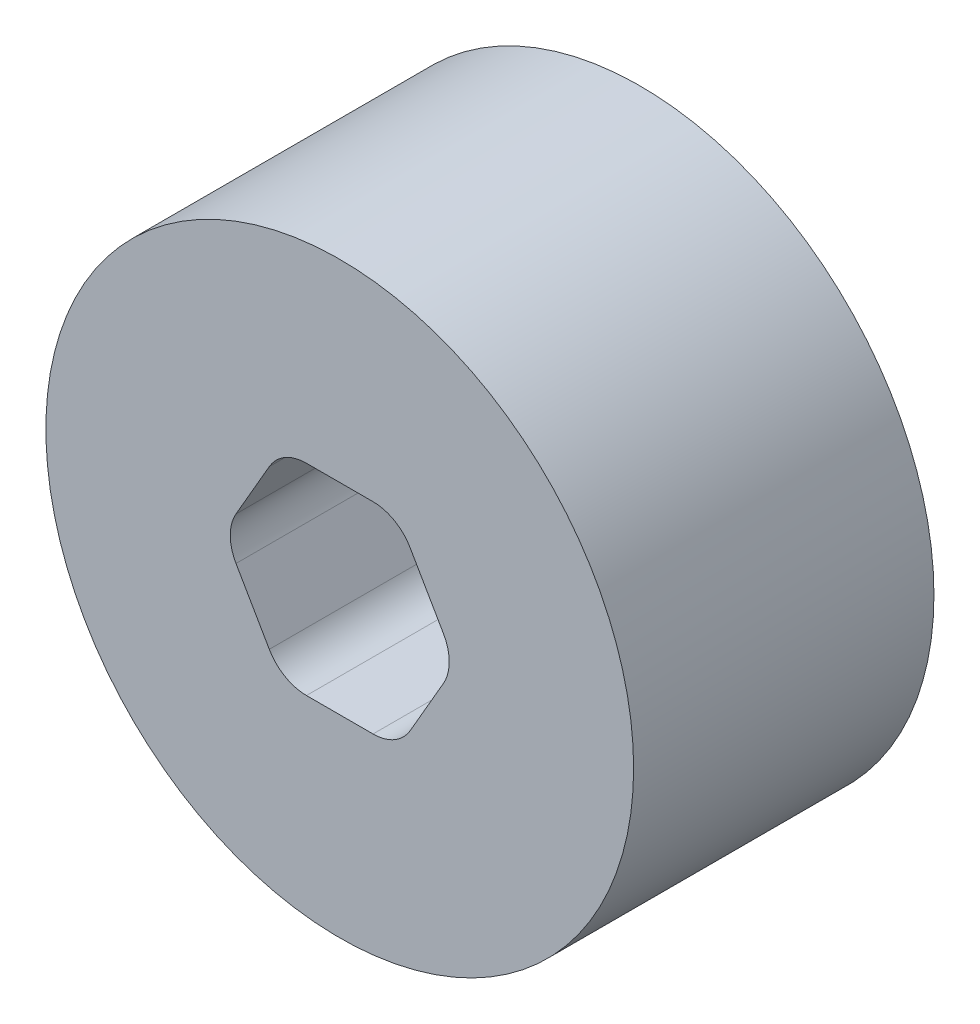
ISO-10303-21;
HEADER;
FILE_DESCRIPTION(('STEP AP214'),'2;1');
FILE_NAME('part.step','',(''),(''),'','','');
FILE_SCHEMA(('AUTOMOTIVE_DESIGN { 1 0 10303 214 1 1 1 1 }'));
ENDSEC;
DATA;
#1=APPLICATION_CONTEXT('core data for automotive mechanical design processes');
#2=APPLICATION_PROTOCOL_DEFINITION('international standard','automotive_design',2000,#1);
#3=PRODUCT_CONTEXT('',#1,'mechanical');
#4=PRODUCT('Part','Part','',(#3));
#5=PRODUCT_RELATED_PRODUCT_CATEGORY('part','',(#4));
#6=PRODUCT_DEFINITION_FORMATION('','',#4);
#7=PRODUCT_DEFINITION_CONTEXT('part definition',#1,'design');
#8=PRODUCT_DEFINITION('design','',#6,#7);
#9=PRODUCT_DEFINITION_SHAPE('','',#8);
#10=(LENGTH_UNIT() NAMED_UNIT(*) SI_UNIT(.MILLI.,.METRE.));
#11=(NAMED_UNIT(*) PLANE_ANGLE_UNIT() SI_UNIT($,.RADIAN.));
#12=(NAMED_UNIT(*) SI_UNIT($,.STERADIAN.) SOLID_ANGLE_UNIT());
#13=UNCERTAINTY_MEASURE_WITH_UNIT(LENGTH_MEASURE(1.E-05),#10,'distance_accuracy_value','');
#14=(GEOMETRIC_REPRESENTATION_CONTEXT(3) GLOBAL_UNCERTAINTY_ASSIGNED_CONTEXT((#13)) GLOBAL_UNIT_ASSIGNED_CONTEXT((#10,
#11,#12)) REPRESENTATION_CONTEXT('',''));
#15=CARTESIAN_POINT('',(0.,0.,0.));
#16=DIRECTION('',(0.,0.,1.));
#17=DIRECTION('',(1.,0.,0.));
#18=AXIS2_PLACEMENT_3D('',#15,#16,#17);
#19=CARTESIAN_POINT('',(0.,0.,17.78));
#20=DIRECTION('',(0.,0.,1.));
#21=DIRECTION('',(1.,0.,0.));
#22=AXIS2_PLACEMENT_3D('',#19,#20,#21);
#23=PLANE('',#22);
#24=CARTESIAN_POINT('',(0.,0.,17.78));
#25=DIRECTION('',(0.,0.,1.));
#26=DIRECTION('',(1.,0.,0.));
#27=AXIS2_PLACEMENT_3D('',#24,#25,#26);
#28=CIRCLE('',#27,17.399);
#29=CARTESIAN_POINT('',(17.399,0.,17.78));
#30=VERTEX_POINT('',#29);
#31=EDGE_CURVE('E160',#30,#30,#28,.T.);
#32=ORIENTED_EDGE('',*,*,#31,.T.);
#33=EDGE_LOOP('',(#32));
#34=FACE_BOUND('',#33,.T.);
#35=DIRECTION('',(-0.500000000000001,0.866025403784438,0.));
#36=VECTOR('',#35,1.);
#37=CARTESIAN_POINT('',(6.87578,0.,17.78));
#38=LINE('',#37,#36);
#39=CARTESIAN_POINT('',(6.14254515812918,1.26999999999999,17.78));
#40=VERTEX_POINT('',#39);
#41=CARTESIAN_POINT('',(4.17112484187082,4.68460015083297,17.78));
#42=VERTEX_POINT('',#41);
#43=EDGE_CURVE('E265',#40,#42,#38,.T.);
#44=ORIENTED_EDGE('',*,*,#43,.F.);
#45=CARTESIAN_POINT('',(3.94284063251671,0.,17.78));
#46=DIRECTION('',(0.,0.,1.));
#47=DIRECTION('',(1.,0.,0.));
#48=AXIS2_PLACEMENT_3D('',#45,#46,#47);
#49=CIRCLE('',#48,2.54);
#50=CARTESIAN_POINT('',(6.14254515812919,-1.26999999999999,17.78));
#51=VERTEX_POINT('',#50);
#52=EDGE_CURVE('E143',#40,#51,#49,.F.);
#53=ORIENTED_EDGE('',*,*,#52,.T.);
#54=DIRECTION('',(0.499999999999995,0.866025403784442,0.));
#55=VECTOR('',#54,1.);
#56=CARTESIAN_POINT('',(3.43789000000007,-5.95460015083293,17.78));
#57=LINE('',#56,#55);
#58=CARTESIAN_POINT('',(4.17112484187088,-4.68460015083293,17.78));
#59=VERTEX_POINT('',#58);
#60=EDGE_CURVE('E263',#59,#51,#57,.T.);
#61=ORIENTED_EDGE('',*,*,#60,.F.);
#62=CARTESIAN_POINT('',(1.9714203162584,-3.41460015083294,17.78));
#63=DIRECTION('',(0.,0.,1.));
#64=DIRECTION('',(1.,0.,0.));
#65=AXIS2_PLACEMENT_3D('',#62,#63,#64);
#66=CIRCLE('',#65,2.54);
#67=CARTESIAN_POINT('',(1.97142031625843,-5.95460015083294,17.78));
#68=VERTEX_POINT('',#67);
#69=EDGE_CURVE('E11',#59,#68,#66,.F.);
#70=ORIENTED_EDGE('',*,*,#69,.T.);
#71=DIRECTION('',(1.,0.,0.));
#72=VECTOR('',#71,1.);
#73=CARTESIAN_POINT('',(-3.43788999999994,-5.954600150833,17.78));
#74=LINE('',#73,#72);
#75=CARTESIAN_POINT('',(-1.97142031625829,-5.95460015083298,17.78));
#76=VERTEX_POINT('',#75);
#77=EDGE_CURVE('E238',#76,#68,#74,.T.);
#78=ORIENTED_EDGE('',*,*,#77,.F.);
#79=CARTESIAN_POINT('',(-1.97142031625832,-3.41460015083298,17.78));
#80=DIRECTION('',(0.,0.,1.));
#81=DIRECTION('',(1.,0.,0.));
#82=AXIS2_PLACEMENT_3D('',#79,#80,#81);
#83=CIRCLE('',#82,2.54);
#84=CARTESIAN_POINT('',(-4.17112484187078,-4.684600150833,17.78));
#85=VERTEX_POINT('',#84);
#86=EDGE_CURVE('E225',#76,#85,#83,.F.);
#87=ORIENTED_EDGE('',*,*,#86,.T.);
#88=DIRECTION('',(0.500000000000007,-0.866025403784435,0.));
#89=VECTOR('',#88,1.);
#90=CARTESIAN_POINT('',(-6.87578,0.,17.78));
#91=LINE('',#90,#89);
#92=CARTESIAN_POINT('',(-6.14254515812916,-1.27000000000005,17.78));
#93=VERTEX_POINT('',#92);
#94=EDGE_CURVE('E241',#93,#85,#91,.T.);
#95=ORIENTED_EDGE('',*,*,#94,.F.);
#96=CARTESIAN_POINT('',(-3.9428406325167,0.,17.78));
#97=DIRECTION('',(0.,0.,1.));
#98=DIRECTION('',(1.,0.,0.));
#99=AXIS2_PLACEMENT_3D('',#96,#97,#98);
#100=CIRCLE('',#99,2.54);
#101=CARTESIAN_POINT('',(-6.14254515812918,1.26999999999996,17.78));
#102=VERTEX_POINT('',#101);
#103=EDGE_CURVE('E219',#93,#102,#100,.F.);
#104=ORIENTED_EDGE('',*,*,#103,.T.);
#105=DIRECTION('',(-0.499999999999995,-0.866025403784442,0.));
#106=VECTOR('',#105,1.);
#107=CARTESIAN_POINT('',(-3.43789000000003,5.95460015083295,17.78));
#108=LINE('',#107,#106);
#109=CARTESIAN_POINT('',(-4.17112484187085,4.68460015083294,17.78));
#110=VERTEX_POINT('',#109);
#111=EDGE_CURVE('E247',#110,#102,#108,.T.);
#112=ORIENTED_EDGE('',*,*,#111,.F.);
#113=CARTESIAN_POINT('',(-1.97142031625836,3.41460015083296,17.78));
#114=DIRECTION('',(0.,0.,1.));
#115=DIRECTION('',(1.,0.,0.));
#116=AXIS2_PLACEMENT_3D('',#113,#114,#115);
#117=CIRCLE('',#116,2.54);
#118=CARTESIAN_POINT('',(-1.97142031625837,5.95460015083296,17.78));
#119=VERTEX_POINT('',#118);
#120=EDGE_CURVE('E213',#110,#119,#117,.F.);
#121=ORIENTED_EDGE('',*,*,#120,.T.);
#122=DIRECTION('',(-1.,0.,0.));
#123=VECTOR('',#122,1.);
#124=CARTESIAN_POINT('',(3.43788999999999,5.95460015083298,17.78));
#125=LINE('',#124,#123);
#126=CARTESIAN_POINT('',(1.97142031625833,5.95460015083297,17.78));
#127=VERTEX_POINT('',#126);
#128=EDGE_CURVE('E268',#127,#119,#125,.T.);
#129=ORIENTED_EDGE('',*,*,#128,.F.);
#130=CARTESIAN_POINT('',(1.97142031625834,3.41460015083297,17.78));
#131=DIRECTION('',(0.,0.,1.));
#132=DIRECTION('',(1.,0.,0.));
#133=AXIS2_PLACEMENT_3D('',#130,#131,#132);
#134=CIRCLE('',#133,2.54);
#135=EDGE_CURVE('E144',#127,#42,#134,.F.);
#136=ORIENTED_EDGE('',*,*,#135,.T.);
#137=EDGE_LOOP('',(#44,#53,#61,#70,#78,#87,#95,#104,#112,#121,#129,#136));
#138=FACE_BOUND('',#137,.T.);
#139=ADVANCED_FACE('F41',(#34,#138),#23,.T.);
#140=CARTESIAN_POINT('',(0.,0.,0.));
#141=DIRECTION('',(0.,0.,1.));
#142=DIRECTION('',(1.,0.,0.));
#143=AXIS2_PLACEMENT_3D('',#140,#141,#142);
#144=PLANE('',#143);
#145=CARTESIAN_POINT('',(0.,0.,0.));
#146=DIRECTION('',(0.,0.,1.));
#147=DIRECTION('',(1.,0.,0.));
#148=AXIS2_PLACEMENT_3D('',#145,#146,#147);
#149=CIRCLE('',#148,17.399);
#150=CARTESIAN_POINT('',(17.399,0.,0.));
#151=VERTEX_POINT('',#150);
#152=EDGE_CURVE('E167',#151,#151,#149,.T.);
#153=ORIENTED_EDGE('',*,*,#152,.F.);
#154=EDGE_LOOP('',(#153));
#155=FACE_BOUND('',#154,.T.);
#156=DIRECTION('',(1.,0.,0.));
#157=VECTOR('',#156,1.);
#158=CARTESIAN_POINT('',(-3.43788999999994,-5.954600150833,0.));
#159=LINE('',#158,#157);
#160=CARTESIAN_POINT('',(-1.97142031625829,-5.95460015083298,0.));
#161=VERTEX_POINT('',#160);
#162=CARTESIAN_POINT('',(1.97142031625843,-5.95460015083294,0.));
#163=VERTEX_POINT('',#162);
#164=EDGE_CURVE('E228',#161,#163,#159,.T.);
#165=ORIENTED_EDGE('',*,*,#164,.T.);
#166=CARTESIAN_POINT('',(1.9714203162584,-3.41460015083294,0.));
#167=DIRECTION('',(0.,0.,1.));
#168=DIRECTION('',(1.,0.,0.));
#169=AXIS2_PLACEMENT_3D('',#166,#167,#168);
#170=CIRCLE('',#169,2.54);
#171=CARTESIAN_POINT('',(4.17112484187088,-4.68460015083293,0.));
#172=VERTEX_POINT('',#171);
#173=EDGE_CURVE('E50',#163,#172,#170,.T.);
#174=ORIENTED_EDGE('',*,*,#173,.T.);
#175=DIRECTION('',(0.499999999999995,0.866025403784442,0.));
#176=VECTOR('',#175,1.);
#177=CARTESIAN_POINT('',(3.43789000000007,-5.95460015083293,0.));
#178=LINE('',#177,#176);
#179=CARTESIAN_POINT('',(6.14254515812919,-1.26999999999999,0.));
#180=VERTEX_POINT('',#179);
#181=EDGE_CURVE('E137',#172,#180,#178,.T.);
#182=ORIENTED_EDGE('',*,*,#181,.T.);
#183=CARTESIAN_POINT('',(3.94284063251671,0.,0.));
#184=DIRECTION('',(0.,0.,1.));
#185=DIRECTION('',(1.,0.,0.));
#186=AXIS2_PLACEMENT_3D('',#183,#184,#185);
#187=CIRCLE('',#186,2.54);
#188=CARTESIAN_POINT('',(6.14254515812918,1.26999999999999,0.));
#189=VERTEX_POINT('',#188);
#190=EDGE_CURVE('E131',#180,#189,#187,.T.);
#191=ORIENTED_EDGE('',*,*,#190,.T.);
#192=DIRECTION('',(-0.500000000000001,0.866025403784438,0.));
#193=VECTOR('',#192,1.);
#194=CARTESIAN_POINT('',(6.87578,0.,0.));
#195=LINE('',#194,#193);
#196=CARTESIAN_POINT('',(4.17112484187082,4.68460015083297,0.));
#197=VERTEX_POINT('',#196);
#198=EDGE_CURVE('E135',#189,#197,#195,.T.);
#199=ORIENTED_EDGE('',*,*,#198,.T.);
#200=CARTESIAN_POINT('',(1.97142031625834,3.41460015083297,0.));
#201=DIRECTION('',(0.,0.,1.));
#202=DIRECTION('',(1.,0.,0.));
#203=AXIS2_PLACEMENT_3D('',#200,#201,#202);
#204=CIRCLE('',#203,2.54);
#205=CARTESIAN_POINT('',(1.97142031625833,5.95460015083297,0.));
#206=VERTEX_POINT('',#205);
#207=EDGE_CURVE('E203',#197,#206,#204,.T.);
#208=ORIENTED_EDGE('',*,*,#207,.T.);
#209=DIRECTION('',(-1.,0.,0.));
#210=VECTOR('',#209,1.);
#211=CARTESIAN_POINT('',(3.43788999999999,5.95460015083298,0.));
#212=LINE('',#211,#210);
#213=CARTESIAN_POINT('',(-1.97142031625837,5.95460015083296,0.));
#214=VERTEX_POINT('',#213);
#215=EDGE_CURVE('E155',#206,#214,#212,.T.);
#216=ORIENTED_EDGE('',*,*,#215,.T.);
#217=CARTESIAN_POINT('',(-1.97142031625836,3.41460015083296,0.));
#218=DIRECTION('',(0.,0.,1.));
#219=DIRECTION('',(1.,0.,0.));
#220=AXIS2_PLACEMENT_3D('',#217,#218,#219);
#221=CIRCLE('',#220,2.54);
#222=CARTESIAN_POINT('',(-4.17112484187085,4.68460015083294,0.));
#223=VERTEX_POINT('',#222);
#224=EDGE_CURVE('E210',#214,#223,#221,.T.);
#225=ORIENTED_EDGE('',*,*,#224,.T.);
#226=DIRECTION('',(-0.499999999999995,-0.866025403784442,0.));
#227=VECTOR('',#226,1.);
#228=CARTESIAN_POINT('',(-3.43789000000003,5.95460015083295,0.));
#229=LINE('',#228,#227);
#230=CARTESIAN_POINT('',(-6.14254515812918,1.26999999999996,0.));
#231=VERTEX_POINT('',#230);
#232=EDGE_CURVE('E254',#223,#231,#229,.T.);
#233=ORIENTED_EDGE('',*,*,#232,.T.);
#234=CARTESIAN_POINT('',(-3.9428406325167,0.,0.));
#235=DIRECTION('',(0.,0.,1.));
#236=DIRECTION('',(1.,0.,0.));
#237=AXIS2_PLACEMENT_3D('',#234,#235,#236);
#238=CIRCLE('',#237,2.54);
#239=CARTESIAN_POINT('',(-6.14254515812916,-1.27000000000005,0.));
#240=VERTEX_POINT('',#239);
#241=EDGE_CURVE('E216',#231,#240,#238,.T.);
#242=ORIENTED_EDGE('',*,*,#241,.T.);
#243=DIRECTION('',(0.500000000000007,-0.866025403784435,0.));
#244=VECTOR('',#243,1.);
#245=CARTESIAN_POINT('',(-6.87578,0.,0.));
#246=LINE('',#245,#244);
#247=CARTESIAN_POINT('',(-4.17112484187078,-4.684600150833,0.));
#248=VERTEX_POINT('',#247);
#249=EDGE_CURVE('E258',#240,#248,#246,.T.);
#250=ORIENTED_EDGE('',*,*,#249,.T.);
#251=CARTESIAN_POINT('',(-1.97142031625832,-3.41460015083298,0.));
#252=DIRECTION('',(0.,0.,1.));
#253=DIRECTION('',(1.,0.,0.));
#254=AXIS2_PLACEMENT_3D('',#251,#252,#253);
#255=CIRCLE('',#254,2.54);
#256=EDGE_CURVE('E222',#248,#161,#255,.T.);
#257=ORIENTED_EDGE('',*,*,#256,.T.);
#258=EDGE_LOOP('',(#165,#174,#182,#191,#199,#208,#216,#225,#233,#242,#250,#257));
#259=FACE_BOUND('',#258,.T.);
#260=ADVANCED_FACE('F134',(#155,#259),#144,.F.);
#261=CARTESIAN_POINT('',(0.,0.,17.78));
#262=DIRECTION('',(0.,0.,-1.));
#263=DIRECTION('',(-1.,0.,0.));
#264=AXIS2_PLACEMENT_3D('',#261,#262,#263);
#265=CYLINDRICAL_SURFACE('',#264,17.399);
#266=ORIENTED_EDGE('',*,*,#31,.F.);
#267=EDGE_LOOP('',(#266));
#268=FACE_BOUND('',#267,.T.);
#269=ORIENTED_EDGE('',*,*,#152,.T.);
#270=EDGE_LOOP('',(#269));
#271=FACE_BOUND('',#270,.T.);
#272=ADVANCED_FACE('F299',(#268,#271),#265,.T.);
#273=CARTESIAN_POINT('',(3.43789000000007,-5.95460015083293,17.78));
#274=DIRECTION('',(-0.866025403784441,0.499999999999995,0.));
#275=DIRECTION('',(-0.499999999999995,-0.866025403784442,0.));
#276=AXIS2_PLACEMENT_3D('',#273,#274,#275);
#277=PLANE('',#276);
#278=ORIENTED_EDGE('',*,*,#60,.T.);
#279=DIRECTION('',(0.,0.,-1.));
#280=VECTOR('',#279,1.);
#281=CARTESIAN_POINT('',(6.14254515812919,-1.27,0.));
#282=LINE('',#281,#280);
#283=EDGE_CURVE('E180',#51,#180,#282,.T.);
#284=ORIENTED_EDGE('',*,*,#283,.T.);
#285=ORIENTED_EDGE('',*,*,#181,.F.);
#286=DIRECTION('',(0.,0.,-1.));
#287=VECTOR('',#286,1.);
#288=CARTESIAN_POINT('',(4.17112484187088,-4.68460015083293,17.78));
#289=LINE('',#288,#287);
#290=EDGE_CURVE('E177',#172,#59,#289,.F.);
#291=ORIENTED_EDGE('',*,*,#290,.T.);
#292=EDGE_LOOP('',(#278,#284,#285,#291));
#293=FACE_BOUND('',#292,.T.);
#294=ADVANCED_FACE('F234',(#293),#277,.T.);
#295=CARTESIAN_POINT('',(6.87578,0.,17.78));
#296=DIRECTION('',(-0.866025403784438,-0.500000000000001,0.));
#297=DIRECTION('',(0.500000000000001,-0.866025403784438,0.));
#298=AXIS2_PLACEMENT_3D('',#295,#296,#297);
#299=PLANE('',#298);
#300=ORIENTED_EDGE('',*,*,#43,.T.);
#301=DIRECTION('',(0.,0.,-1.));
#302=VECTOR('',#301,1.);
#303=CARTESIAN_POINT('',(4.17112484187081,4.68460015083297,0.));
#304=LINE('',#303,#302);
#305=EDGE_CURVE('E153',#42,#197,#304,.T.);
#306=ORIENTED_EDGE('',*,*,#305,.T.);
#307=ORIENTED_EDGE('',*,*,#198,.F.);
#308=DIRECTION('',(0.,0.,-1.));
#309=VECTOR('',#308,1.);
#310=CARTESIAN_POINT('',(6.14254515812918,1.26999999999999,17.78));
#311=LINE('',#310,#309);
#312=EDGE_CURVE('E150',#189,#40,#311,.F.);
#313=ORIENTED_EDGE('',*,*,#312,.T.);
#314=EDGE_LOOP('',(#300,#306,#307,#313));
#315=FACE_BOUND('',#314,.T.);
#316=ADVANCED_FACE('F149',(#315),#299,.T.);
#317=CARTESIAN_POINT('',(3.43788999999999,5.95460015083298,17.78));
#318=DIRECTION('',(0.,-1.,0.));
#319=DIRECTION('',(1.,0.,0.));
#320=AXIS2_PLACEMENT_3D('',#317,#318,#319);
#321=PLANE('',#320);
#322=ORIENTED_EDGE('',*,*,#215,.F.);
#323=DIRECTION('',(0.,0.,-1.));
#324=VECTOR('',#323,1.);
#325=CARTESIAN_POINT('',(1.97142031625833,5.95460015083297,17.78));
#326=LINE('',#325,#324);
#327=EDGE_CURVE('E174',#206,#127,#326,.F.);
#328=ORIENTED_EDGE('',*,*,#327,.T.);
#329=ORIENTED_EDGE('',*,*,#128,.T.);
#330=DIRECTION('',(0.,0.,-1.));
#331=VECTOR('',#330,1.);
#332=CARTESIAN_POINT('',(-1.97142031625837,5.95460015083296,0.));
#333=LINE('',#332,#331);
#334=EDGE_CURVE('E164',#119,#214,#333,.T.);
#335=ORIENTED_EDGE('',*,*,#334,.T.);
#336=EDGE_LOOP('',(#322,#328,#329,#335));
#337=FACE_BOUND('',#336,.T.);
#338=ADVANCED_FACE('F378',(#337),#321,.T.);
#339=CARTESIAN_POINT('',(-3.43789000000003,5.95460015083295,17.78));
#340=DIRECTION('',(0.866025403784442,-0.499999999999995,0.));
#341=DIRECTION('',(0.499999999999995,0.866025403784442,0.));
#342=AXIS2_PLACEMENT_3D('',#339,#340,#341);
#343=PLANE('',#342);
#344=ORIENTED_EDGE('',*,*,#232,.F.);
#345=DIRECTION('',(0.,0.,-1.));
#346=VECTOR('',#345,1.);
#347=CARTESIAN_POINT('',(-4.17112484187085,4.68460015083294,17.78));
#348=LINE('',#347,#346);
#349=EDGE_CURVE('E187',#223,#110,#348,.F.);
#350=ORIENTED_EDGE('',*,*,#349,.T.);
#351=ORIENTED_EDGE('',*,*,#111,.T.);
#352=DIRECTION('',(0.,0.,-1.));
#353=VECTOR('',#352,1.);
#354=CARTESIAN_POINT('',(-6.14254515812918,1.26999999999996,0.));
#355=LINE('',#354,#353);
#356=EDGE_CURVE('E183',#102,#231,#355,.T.);
#357=ORIENTED_EDGE('',*,*,#356,.T.);
#358=EDGE_LOOP('',(#344,#350,#351,#357));
#359=FACE_BOUND('',#358,.T.);
#360=ADVANCED_FACE('F279',(#359),#343,.T.);
#361=CARTESIAN_POINT('',(-6.87578,0.,17.78));
#362=DIRECTION('',(0.866025403784435,0.500000000000007,0.));
#363=DIRECTION('',(-0.500000000000007,0.866025403784435,0.));
#364=AXIS2_PLACEMENT_3D('',#361,#362,#363);
#365=PLANE('',#364);
#366=ORIENTED_EDGE('',*,*,#249,.F.);
#367=DIRECTION('',(0.,0.,-1.));
#368=VECTOR('',#367,1.);
#369=CARTESIAN_POINT('',(-6.14254515812916,-1.27000000000004,17.78));
#370=LINE('',#369,#368);
#371=EDGE_CURVE('E194',#240,#93,#370,.F.);
#372=ORIENTED_EDGE('',*,*,#371,.T.);
#373=ORIENTED_EDGE('',*,*,#94,.T.);
#374=DIRECTION('',(0.,0.,-1.));
#375=VECTOR('',#374,1.);
#376=CARTESIAN_POINT('',(-4.17112484187078,-4.684600150833,0.));
#377=LINE('',#376,#375);
#378=EDGE_CURVE('E190',#85,#248,#377,.T.);
#379=ORIENTED_EDGE('',*,*,#378,.T.);
#380=EDGE_LOOP('',(#366,#372,#373,#379));
#381=FACE_BOUND('',#380,.T.);
#382=ADVANCED_FACE('F288',(#381),#365,.T.);
#383=CARTESIAN_POINT('',(-3.43788999999994,-5.954600150833,17.78));
#384=DIRECTION('',(0.,1.,0.));
#385=DIRECTION('',(-1.,0.,0.));
#386=AXIS2_PLACEMENT_3D('',#383,#384,#385);
#387=PLANE('',#386);
#388=ORIENTED_EDGE('',*,*,#164,.F.);
#389=DIRECTION('',(0.,0.,-1.));
#390=VECTOR('',#389,1.);
#391=CARTESIAN_POINT('',(-1.97142031625829,-5.95460015083298,17.78));
#392=LINE('',#391,#390);
#393=EDGE_CURVE('E62',#161,#76,#392,.F.);
#394=ORIENTED_EDGE('',*,*,#393,.T.);
#395=ORIENTED_EDGE('',*,*,#77,.T.);
#396=DIRECTION('',(0.,0.,-1.));
#397=VECTOR('',#396,1.);
#398=CARTESIAN_POINT('',(1.97142031625843,-5.95460015083294,0.));
#399=LINE('',#398,#397);
#400=EDGE_CURVE('E197',#68,#163,#399,.T.);
#401=ORIENTED_EDGE('',*,*,#400,.T.);
#402=EDGE_LOOP('',(#388,#394,#395,#401));
#403=FACE_BOUND('',#402,.T.);
#404=ADVANCED_FACE('F237',(#403),#387,.T.);
#405=CARTESIAN_POINT('',(1.97142031625834,3.41460015083297,17.78));
#406=DIRECTION('',(0.,0.,1.));
#407=DIRECTION('',(1.,0.,0.));
#408=AXIS2_PLACEMENT_3D('',#405,#406,#407);
#409=CYLINDRICAL_SURFACE('',#408,2.54);
#410=ORIENTED_EDGE('',*,*,#135,.F.);
#411=ORIENTED_EDGE('',*,*,#327,.F.);
#412=ORIENTED_EDGE('',*,*,#207,.F.);
#413=ORIENTED_EDGE('',*,*,#305,.F.);
#414=EDGE_LOOP('',(#410,#411,#412,#413));
#415=FACE_BOUND('',#414,.T.);
#416=ADVANCED_FACE('F308',(#415),#409,.F.);
#417=CARTESIAN_POINT('',(3.94284063251671,0.,17.78));
#418=DIRECTION('',(0.,0.,1.));
#419=DIRECTION('',(1.,0.,0.));
#420=AXIS2_PLACEMENT_3D('',#417,#418,#419);
#421=CYLINDRICAL_SURFACE('',#420,2.54);
#422=ORIENTED_EDGE('',*,*,#52,.F.);
#423=ORIENTED_EDGE('',*,*,#312,.F.);
#424=ORIENTED_EDGE('',*,*,#190,.F.);
#425=ORIENTED_EDGE('',*,*,#283,.F.);
#426=EDGE_LOOP('',(#422,#423,#424,#425));
#427=FACE_BOUND('',#426,.T.);
#428=ADVANCED_FACE('F158',(#427),#421,.F.);
#429=CARTESIAN_POINT('',(-1.97142031625836,3.41460015083296,17.78));
#430=DIRECTION('',(0.,0.,1.));
#431=DIRECTION('',(1.,0.,0.));
#432=AXIS2_PLACEMENT_3D('',#429,#430,#431);
#433=CYLINDRICAL_SURFACE('',#432,2.54);
#434=ORIENTED_EDGE('',*,*,#120,.F.);
#435=ORIENTED_EDGE('',*,*,#349,.F.);
#436=ORIENTED_EDGE('',*,*,#224,.F.);
#437=ORIENTED_EDGE('',*,*,#334,.F.);
#438=EDGE_LOOP('',(#434,#435,#436,#437));
#439=FACE_BOUND('',#438,.T.);
#440=ADVANCED_FACE('F314',(#439),#433,.F.);
#441=CARTESIAN_POINT('',(-3.9428406325167,0.,17.78));
#442=DIRECTION('',(0.,0.,1.));
#443=DIRECTION('',(1.,0.,0.));
#444=AXIS2_PLACEMENT_3D('',#441,#442,#443);
#445=CYLINDRICAL_SURFACE('',#444,2.54);
#446=ORIENTED_EDGE('',*,*,#103,.F.);
#447=ORIENTED_EDGE('',*,*,#371,.F.);
#448=ORIENTED_EDGE('',*,*,#241,.F.);
#449=ORIENTED_EDGE('',*,*,#356,.F.);
#450=EDGE_LOOP('',(#446,#447,#448,#449));
#451=FACE_BOUND('',#450,.T.);
#452=ADVANCED_FACE('F284',(#451),#445,.F.);
#453=CARTESIAN_POINT('',(-1.97142031625832,-3.41460015083298,17.78));
#454=DIRECTION('',(0.,0.,1.));
#455=DIRECTION('',(1.,0.,0.));
#456=AXIS2_PLACEMENT_3D('',#453,#454,#455);
#457=CYLINDRICAL_SURFACE('',#456,2.54);
#458=ORIENTED_EDGE('',*,*,#86,.F.);
#459=ORIENTED_EDGE('',*,*,#393,.F.);
#460=ORIENTED_EDGE('',*,*,#256,.F.);
#461=ORIENTED_EDGE('',*,*,#378,.F.);
#462=EDGE_LOOP('',(#458,#459,#460,#461));
#463=FACE_BOUND('',#462,.T.);
#464=ADVANCED_FACE('F292',(#463),#457,.F.);
#465=CARTESIAN_POINT('',(1.9714203162584,-3.41460015083294,17.78));
#466=DIRECTION('',(0.,0.,1.));
#467=DIRECTION('',(1.,0.,0.));
#468=AXIS2_PLACEMENT_3D('',#465,#466,#467);
#469=CYLINDRICAL_SURFACE('',#468,2.54);
#470=ORIENTED_EDGE('',*,*,#69,.F.);
#471=ORIENTED_EDGE('',*,*,#290,.F.);
#472=ORIENTED_EDGE('',*,*,#173,.F.);
#473=ORIENTED_EDGE('',*,*,#400,.F.);
#474=EDGE_LOOP('',(#470,#471,#472,#473));
#475=FACE_BOUND('',#474,.T.);
#476=ADVANCED_FACE('F43',(#475),#469,.F.);
#477=CLOSED_SHELL('',(#139,#260,#272,#294,#316,#338,#360,#382,#404,#416,#428,#440,#452,#464,#476));
#478=MANIFOLD_SOLID_BREP('B2',#477);
#479=ADVANCED_BREP_SHAPE_REPRESENTATION('',(#18,#478),#14);
#480=SHAPE_DEFINITION_REPRESENTATION(#9,#479);
ENDSEC;
END-ISO-10303-21;
